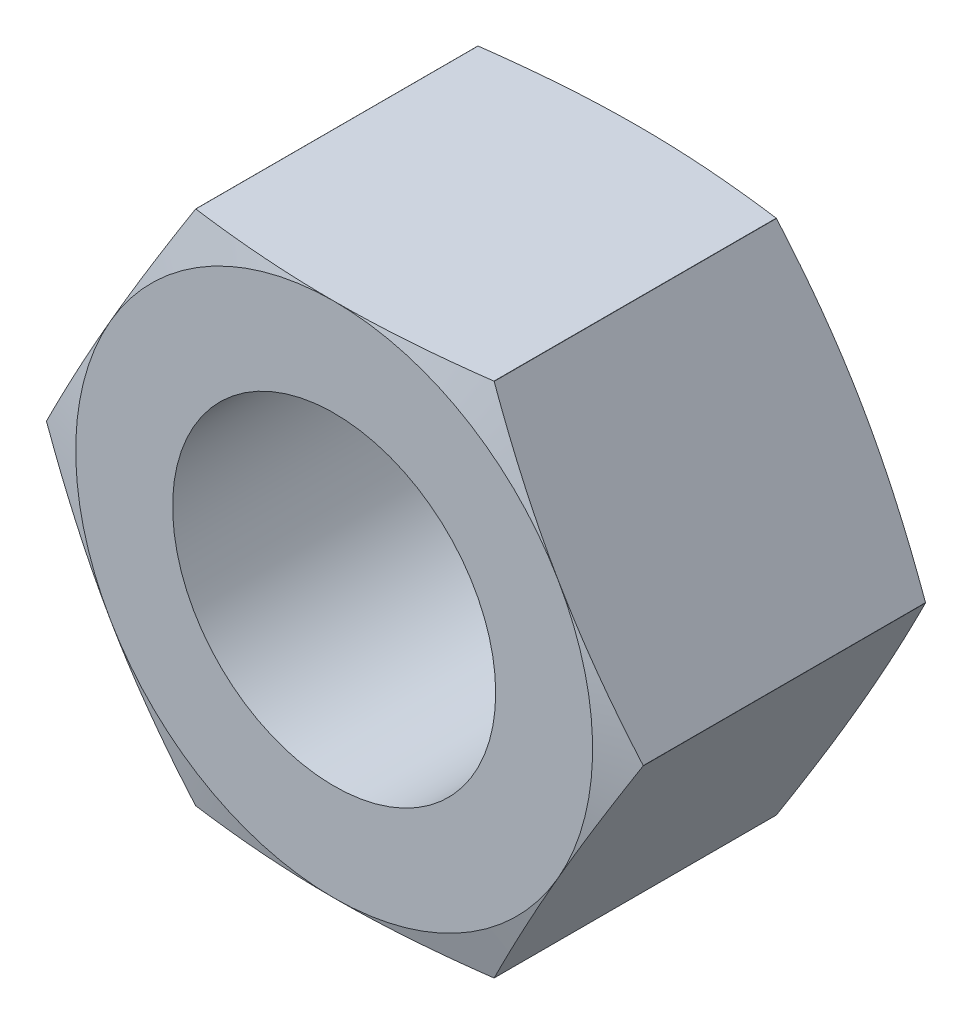
ISO-10303-21;
HEADER;
FILE_DESCRIPTION(('STEP AP214'),'2;1');
FILE_NAME('part.step','',(''),(''),'','','');
FILE_SCHEMA(('AUTOMOTIVE_DESIGN { 1 0 10303 214 1 1 1 1 }'));
ENDSEC;
DATA;
#1=APPLICATION_CONTEXT('core data for automotive mechanical design processes');
#2=APPLICATION_PROTOCOL_DEFINITION('international standard','automotive_design',2000,#1);
#3=PRODUCT_CONTEXT('',#1,'mechanical');
#4=PRODUCT('Part','Part','',(#3));
#5=PRODUCT_RELATED_PRODUCT_CATEGORY('part','',(#4));
#6=PRODUCT_DEFINITION_FORMATION('','',#4);
#7=PRODUCT_DEFINITION_CONTEXT('part definition',#1,'design');
#8=PRODUCT_DEFINITION('design','',#6,#7);
#9=PRODUCT_DEFINITION_SHAPE('','',#8);
#10=(LENGTH_UNIT() NAMED_UNIT(*) SI_UNIT(.MILLI.,.METRE.));
#11=(NAMED_UNIT(*) PLANE_ANGLE_UNIT() SI_UNIT($,.RADIAN.));
#12=(NAMED_UNIT(*) SI_UNIT($,.STERADIAN.) SOLID_ANGLE_UNIT());
#13=UNCERTAINTY_MEASURE_WITH_UNIT(LENGTH_MEASURE(1.E-05),#10,'distance_accuracy_value','');
#14=(GEOMETRIC_REPRESENTATION_CONTEXT(3) GLOBAL_UNCERTAINTY_ASSIGNED_CONTEXT((#13)) GLOBAL_UNIT_ASSIGNED_CONTEXT((#10,
#11,#12)) REPRESENTATION_CONTEXT('',''));
#15=CARTESIAN_POINT('',(0.,0.,0.));
#16=DIRECTION('',(0.,0.,1.));
#17=DIRECTION('',(1.,0.,0.));
#18=AXIS2_PLACEMENT_3D('',#15,#16,#17);
#19=CARTESIAN_POINT('',(0.,0.,0.));
#20=DIRECTION('',(0.,0.,1.));
#21=DIRECTION('',(1.,0.,0.));
#22=AXIS2_PLACEMENT_3D('',#19,#20,#21);
#23=CONICAL_SURFACE('',#22,4.,1.308592322597);
#24=CARTESIAN_POINT('',(0.,0.,0.16580753731));
#25=DIRECTION('',(0.,0.,-1.));
#26=DIRECTION('',(0.999999929611305,0.000375203124259415,0.));
#27=AXIS2_PLACEMENT_3D('',#24,#25,#26);
#28=CIRCLE('',#27,4.617802153517);
#29=CARTESIAN_POINT('',(4.617801828476,0.00173261379521,0.16580753731));
#30=VERTEX_POINT('',#29);
#31=CARTESIAN_POINT('',(4.617801828476,-0.001732613795211,0.16580753731));
#32=VERTEX_POINT('',#31);
#33=EDGE_CURVE('E386',#30,#32,#28,.T.);
#34=ORIENTED_EDGE('',*,*,#33,.T.);
#35=CARTESIAN_POINT('',(3.4641016077439,-2.00000001280694,0.));
#36=CARTESIAN_POINT('',(3.99959787474147,-1.07249327110416,-1.0626646996592E-09));
#37=CARTESIAN_POINT('',(4.617801828477,-0.00173261379480593,0.165807537309771));
#38=(BOUNDED_CURVE() B_SPLINE_CURVE(2,(#35,#36,#37),.UNSPECIFIED.,.F.,
.F.) B_SPLINE_CURVE_WITH_KNOTS((3,3),(0.,1.),
.UNSPECIFIED.) CURVE() GEOMETRIC_REPRESENTATION_ITEM() RATIONAL_B_SPLINE_CURVE((1.,
1.03789463350383,1.)) REPRESENTATION_ITEM(''));
#39=CARTESIAN_POINT('',(3.464101607744,-2.000000012807,0.));
#40=VERTEX_POINT('',#39);
#41=EDGE_CURVE('E231',#40,#32,#38,.T.);
#42=ORIENTED_EDGE('',*,*,#41,.F.);
#43=CARTESIAN_POINT('',(0.,0.,0.));
#44=DIRECTION('',(0.,0.,-1.));
#45=DIRECTION('',(0.866025401935822,0.500000003201897,0.));
#46=AXIS2_PLACEMENT_3D('',#43,#44,#45);
#47=CIRCLE('',#46,4.);
#48=CARTESIAN_POINT('',(3.464101607744,2.000000012807,0.));
#49=VERTEX_POINT('',#48);
#50=EDGE_CURVE('E223',#49,#40,#47,.T.);
#51=ORIENTED_EDGE('',*,*,#50,.F.);
#52=CARTESIAN_POINT('',(4.6178018284753,0.00173261379775691,0.165807537309314));
#53=CARTESIAN_POINT('',(3.99959787474079,1.07249327110535,-1.06266462296389E-09));
#54=CARTESIAN_POINT('',(3.4641016077439,2.00000001280694,0.));
#55=(BOUNDED_CURVE() B_SPLINE_CURVE(2,(#52,#53,#54),.UNSPECIFIED.,.F.,
.F.) B_SPLINE_CURVE_WITH_KNOTS((3,3),(0.,1.),
.UNSPECIFIED.) CURVE() GEOMETRIC_REPRESENTATION_ITEM() RATIONAL_B_SPLINE_CURVE((1.,
1.03789463350372,1.)) REPRESENTATION_ITEM(''));
#56=EDGE_CURVE('E207',#30,#49,#55,.T.);
#57=ORIENTED_EDGE('',*,*,#56,.F.);
#58=EDGE_LOOP('',(#34,#42,#51,#57));
#59=FACE_BOUND('',#58,.T.);
#60=ADVANCED_FACE('F16',(#59),#23,.T.);
#61=CARTESIAN_POINT('',(0.,0.,0.));
#62=DIRECTION('',(0.,0.,1.));
#63=DIRECTION('',(1.,0.,0.));
#64=AXIS2_PLACEMENT_3D('',#61,#62,#63);
#65=CONICAL_SURFACE('',#64,4.,1.308592322597);
#66=CARTESIAN_POINT('',(0.,0.,0.));
#67=DIRECTION('',(0.,0.,1.));
#68=DIRECTION('',(1.,0.,0.));
#69=AXIS2_PLACEMENT_3D('',#66,#67,#68);
#70=CIRCLE('',#69,4.);
#71=CARTESIAN_POINT('',(0.,-4.,0.));
#72=VERTEX_POINT('',#71);
#73=EDGE_CURVE('E234',#72,#40,#70,.T.);
#74=ORIENTED_EDGE('',*,*,#73,.T.);
#75=CARTESIAN_POINT('',(2.31040140180052,-3.99826738620256,0.165807537309363));
#76=CARTESIAN_POINT('',(2.92860534761097,-2.92750674261984,1.06266470623062E-09));
#77=CARTESIAN_POINT('',(3.4641016077439,-2.00000001280694,0.));
#78=(BOUNDED_CURVE() B_SPLINE_CURVE(2,(#75,#76,#77),.UNSPECIFIED.,.F.,
.F.) B_SPLINE_CURVE_WITH_KNOTS((3,3),(0.,1.),
.UNSPECIFIED.) CURVE() GEOMETRIC_REPRESENTATION_ITEM() RATIONAL_B_SPLINE_CURVE((1.,
1.03789463247634,1.)) REPRESENTATION_ITEM(''));
#79=CARTESIAN_POINT('',(2.3104014018,-3.998267386205,0.16580753731));
#80=VERTEX_POINT('',#79);
#81=EDGE_CURVE('E368',#80,#40,#78,.T.);
#82=ORIENTED_EDGE('',*,*,#81,.F.);
#83=CARTESIAN_POINT('',(0.,0.,0.16580753731));
#84=DIRECTION('',(0.,0.,1.));
#85=DIRECTION('',(1.,0.,0.));
#86=AXIS2_PLACEMENT_3D('',#83,#84,#85);
#87=CIRCLE('',#86,4.617802153517);
#88=CARTESIAN_POINT('',(2.307400426676,-4.,0.16580753731));
#89=VERTEX_POINT('',#88);
#90=EDGE_CURVE('E11',#89,#80,#87,.T.);
#91=ORIENTED_EDGE('',*,*,#90,.F.);
#92=CARTESIAN_POINT('',(0.,-4.,0.));
#93=CARTESIAN_POINT('',(1.07099252713086,-4.,0.));
#94=CARTESIAN_POINT('',(2.30740042667724,-4.,0.165807537309668));
#95=(BOUNDED_CURVE() B_SPLINE_CURVE(2,(#92,#93,#94),.UNSPECIFIED.,.F.,
.F.) B_SPLINE_CURVE_WITH_KNOTS((3,3),(0.,1.),
.UNSPECIFIED.) CURVE() GEOMETRIC_REPRESENTATION_ITEM() RATIONAL_B_SPLINE_CURVE((1.,
1.0378946329901,1.)) REPRESENTATION_ITEM(''));
#96=EDGE_CURVE('E28',#72,#89,#95,.T.);
#97=ORIENTED_EDGE('',*,*,#96,.F.);
#98=EDGE_LOOP('',(#74,#82,#91,#97));
#99=FACE_BOUND('',#98,.T.);
#100=ADVANCED_FACE('F558',(#99),#65,.T.);
#101=CARTESIAN_POINT('',(0.,0.,0.));
#102=DIRECTION('',(0.,0.,1.));
#103=DIRECTION('',(1.,0.,0.));
#104=AXIS2_PLACEMENT_3D('',#101,#102,#103);
#105=CONICAL_SURFACE('',#104,4.,1.308592322597);
#106=CARTESIAN_POINT('',(0.,0.,0.));
#107=DIRECTION('',(0.,0.,1.));
#108=DIRECTION('',(1.,0.,0.));
#109=AXIS2_PLACEMENT_3D('',#106,#107,#108);
#110=CIRCLE('',#109,4.);
#111=CARTESIAN_POINT('',(-3.464101607744,-2.000000012807,0.));
#112=VERTEX_POINT('',#111);
#113=EDGE_CURVE('E241',#112,#72,#110,.T.);
#114=ORIENTED_EDGE('',*,*,#113,.T.);
#115=CARTESIAN_POINT('',(-2.30740042667229,-4.,0.165807537309004));
#116=CARTESIAN_POINT('',(-1.07099252712877,-4.,0.));
#117=CARTESIAN_POINT('',(0.,-4.,0.));
#118=(BOUNDED_CURVE() B_SPLINE_CURVE(2,(#115,#116,#117),.UNSPECIFIED.,.F.,
.F.) B_SPLINE_CURVE_WITH_KNOTS((3,3),(0.,1.),
.UNSPECIFIED.) CURVE() GEOMETRIC_REPRESENTATION_ITEM() RATIONAL_B_SPLINE_CURVE((1.,
1.03789463298995,1.)) REPRESENTATION_ITEM(''));
#119=CARTESIAN_POINT('',(-2.307400426676,-4.,0.16580753731));
#120=VERTEX_POINT('',#119);
#121=EDGE_CURVE('E20',#120,#72,#118,.T.);
#122=ORIENTED_EDGE('',*,*,#121,.F.);
#123=CARTESIAN_POINT('',(0.,0.,0.16580753731));
#124=DIRECTION('',(0.,0.,1.));
#125=DIRECTION('',(1.,0.,0.));
#126=AXIS2_PLACEMENT_3D('',#123,#124,#125);
#127=CIRCLE('',#126,4.617802153517);
#128=CARTESIAN_POINT('',(-2.3104014018,-3.998267386205,0.16580753731));
#129=VERTEX_POINT('',#128);
#130=EDGE_CURVE('E498',#129,#120,#127,.T.);
#131=ORIENTED_EDGE('',*,*,#130,.F.);
#132=CARTESIAN_POINT('',(-3.4641016077439,-2.00000001280694,0.));
#133=CARTESIAN_POINT('',(-2.92860534761033,-2.92750674262094,1.06266461828561E-09));
#134=CARTESIAN_POINT('',(-2.31040140179894,-3.9982673862053,0.165807537309788));
#135=(BOUNDED_CURVE() B_SPLINE_CURVE(2,(#132,#133,#134),.UNSPECIFIED.,.F.,
.F.) B_SPLINE_CURVE_WITH_KNOTS((3,3),(0.,1.),
.UNSPECIFIED.) CURVE() GEOMETRIC_REPRESENTATION_ITEM() RATIONAL_B_SPLINE_CURVE((1.,
1.03789463247645,1.)) REPRESENTATION_ITEM(''));
#136=EDGE_CURVE('E527',#112,#129,#135,.T.);
#137=ORIENTED_EDGE('',*,*,#136,.F.);
#138=EDGE_LOOP('',(#114,#122,#131,#137));
#139=FACE_BOUND('',#138,.T.);
#140=ADVANCED_FACE('F18',(#139),#105,.T.);
#141=CARTESIAN_POINT('',(0.,0.,0.));
#142=DIRECTION('',(0.,0.,1.));
#143=DIRECTION('',(1.,0.,0.));
#144=AXIS2_PLACEMENT_3D('',#141,#142,#143);
#145=CONICAL_SURFACE('',#144,4.,1.308592322597);
#146=CARTESIAN_POINT('',(-3.46410161603001,1.999999998455,0.));
#147=CARTESIAN_POINT('',(-3.99959787918154,1.07249326341375,1.28197105117661E-10));
#148=CARTESIAN_POINT('',(-4.617801828477,0.00173261379480638,0.165807537309771));
#149=(BOUNDED_CURVE() B_SPLINE_CURVE(2,(#146,#147,#148),.UNSPECIFIED.,.F.,
.F.) B_SPLINE_CURVE_WITH_KNOTS((3,3),(0.,1.),
.UNSPECIFIED.) CURVE() GEOMETRIC_REPRESENTATION_ITEM() RATIONAL_B_SPLINE_CURVE((1.,
1.03789463292816,1.)) REPRESENTATION_ITEM(''));
#150=CARTESIAN_POINT('',(-3.46410161603,1.999999998455,0.));
#151=VERTEX_POINT('',#150);
#152=CARTESIAN_POINT('',(-4.617801828476,0.001732613795212,0.16580753731));
#153=VERTEX_POINT('',#152);
#154=EDGE_CURVE('E491',#151,#153,#149,.T.);
#155=ORIENTED_EDGE('',*,*,#154,.F.);
#156=CARTESIAN_POINT('',(0.,0.,0.));
#157=DIRECTION('',(0.,0.,1.));
#158=DIRECTION('',(1.,0.,0.));
#159=AXIS2_PLACEMENT_3D('',#156,#157,#158);
#160=CIRCLE('',#159,4.);
#161=EDGE_CURVE('E258',#151,#112,#160,.T.);
#162=ORIENTED_EDGE('',*,*,#161,.T.);
#163=CARTESIAN_POINT('',(-4.6178018284753,-0.00173261379775847,0.165807537309314));
#164=CARTESIAN_POINT('',(-3.99959787474079,-1.07249327110535,-1.06266462296389E-09));
#165=CARTESIAN_POINT('',(-3.4641016077439,-2.00000001280694,0.));
#166=(BOUNDED_CURVE() B_SPLINE_CURVE(2,(#163,#164,#165),.UNSPECIFIED.,.F.,
.F.) B_SPLINE_CURVE_WITH_KNOTS((3,3),(0.,1.),
.UNSPECIFIED.) CURVE() GEOMETRIC_REPRESENTATION_ITEM() RATIONAL_B_SPLINE_CURVE((1.,
1.03789463350372,1.)) REPRESENTATION_ITEM(''));
#167=CARTESIAN_POINT('',(-4.617801828476,-0.001732613795211,0.16580753731));
#168=VERTEX_POINT('',#167);
#169=EDGE_CURVE('E276',#168,#112,#166,.T.);
#170=ORIENTED_EDGE('',*,*,#169,.F.);
#171=CARTESIAN_POINT('',(0.,0.,0.16580753731));
#172=DIRECTION('',(0.,0.,1.));
#173=DIRECTION('',(1.,0.,0.));
#174=AXIS2_PLACEMENT_3D('',#171,#172,#173);
#175=CIRCLE('',#174,4.617802153517);
#176=EDGE_CURVE('E504',#153,#168,#175,.T.);
#177=ORIENTED_EDGE('',*,*,#176,.F.);
#178=EDGE_LOOP('',(#155,#162,#170,#177));
#179=FACE_BOUND('',#178,.T.);
#180=ADVANCED_FACE('F586',(#179),#145,.T.);
#181=CARTESIAN_POINT('',(0.,0.,0.));
#182=DIRECTION('',(0.,0.,1.));
#183=DIRECTION('',(1.,0.,0.));
#184=AXIS2_PLACEMENT_3D('',#181,#182,#183);
#185=CONICAL_SURFACE('',#184,4.,1.308592322597);
#186=CARTESIAN_POINT('',(2.69946742916274E-13,4.,0.));
#187=CARTESIAN_POINT('',(-1.07099252713066,4.,0.));
#188=CARTESIAN_POINT('',(-2.30740042667724,4.,0.165807537309668));
#189=(BOUNDED_CURVE() B_SPLINE_CURVE(2,(#186,#187,#188),.UNSPECIFIED.,.F.,
.F.) B_SPLINE_CURVE_WITH_KNOTS((3,3),(0.,1.),
.UNSPECIFIED.) CURVE() GEOMETRIC_REPRESENTATION_ITEM() RATIONAL_B_SPLINE_CURVE((1.,
1.03789463299012,1.)) REPRESENTATION_ITEM(''));
#190=CARTESIAN_POINT('',(2.69462570454E-13,4.,0.));
#191=VERTEX_POINT('',#190);
#192=CARTESIAN_POINT('',(-2.307400426676,4.,0.16580753731));
#193=VERTEX_POINT('',#192);
#194=EDGE_CURVE('E425',#191,#193,#189,.T.);
#195=ORIENTED_EDGE('',*,*,#194,.F.);
#196=CARTESIAN_POINT('',(0.,0.,0.));
#197=DIRECTION('',(0.,0.,1.));
#198=DIRECTION('',(1.,0.,0.));
#199=AXIS2_PLACEMENT_3D('',#196,#197,#198);
#200=CIRCLE('',#199,4.);
#201=EDGE_CURVE('E226',#191,#151,#200,.T.);
#202=ORIENTED_EDGE('',*,*,#201,.T.);
#203=CARTESIAN_POINT('',(-2.31040140180052,3.99826738620256,0.165807537309363));
#204=CARTESIAN_POINT('',(-2.92860535205103,2.92750673492943,-1.28197091830984E-10));
#205=CARTESIAN_POINT('',(-3.46410161603001,1.999999998455,0.));
#206=(BOUNDED_CURVE() B_SPLINE_CURVE(2,(#203,#204,#205),.UNSPECIFIED.,.F.,
.F.) B_SPLINE_CURVE_WITH_KNOTS((3,3),(0.,1.),
.UNSPECIFIED.) CURVE() GEOMETRIC_REPRESENTATION_ITEM() RATIONAL_B_SPLINE_CURVE((1.,
1.03789463305202,1.)) REPRESENTATION_ITEM(''));
#207=CARTESIAN_POINT('',(-2.3104014018,3.998267386205,0.16580753731));
#208=VERTEX_POINT('',#207);
#209=EDGE_CURVE('E482',#208,#151,#206,.T.);
#210=ORIENTED_EDGE('',*,*,#209,.F.);
#211=CARTESIAN_POINT('',(0.,0.,0.16580753731));
#212=DIRECTION('',(0.,0.,1.));
#213=DIRECTION('',(1.,0.,0.));
#214=AXIS2_PLACEMENT_3D('',#211,#212,#213);
#215=CIRCLE('',#214,4.617802153517);
#216=EDGE_CURVE('E417',#193,#208,#215,.T.);
#217=ORIENTED_EDGE('',*,*,#216,.F.);
#218=EDGE_LOOP('',(#195,#202,#210,#217));
#219=FACE_BOUND('',#218,.T.);
#220=ADVANCED_FACE('F592',(#219),#185,.T.);
#221=CARTESIAN_POINT('',(0.,0.,0.));
#222=DIRECTION('',(0.,0.,1.));
#223=DIRECTION('',(1.,0.,0.));
#224=AXIS2_PLACEMENT_3D('',#221,#222,#223);
#225=CONICAL_SURFACE('',#224,4.,1.308592322597);
#226=CARTESIAN_POINT('',(3.4641016077439,2.00000001280694,0.));
#227=CARTESIAN_POINT('',(2.92860534761033,2.92750674262094,1.06266461828561E-09));
#228=CARTESIAN_POINT('',(2.31040140179894,3.9982673862053,0.165807537309788));
#229=(BOUNDED_CURVE() B_SPLINE_CURVE(2,(#226,#227,#228),.UNSPECIFIED.,.F.,
.F.) B_SPLINE_CURVE_WITH_KNOTS((3,3),(0.,1.),
.UNSPECIFIED.) CURVE() GEOMETRIC_REPRESENTATION_ITEM() RATIONAL_B_SPLINE_CURVE((1.,
1.03789463247645,1.)) REPRESENTATION_ITEM(''));
#230=CARTESIAN_POINT('',(2.3104014018,3.998267386205,0.16580753731));
#231=VERTEX_POINT('',#230);
#232=EDGE_CURVE('E195',#49,#231,#229,.T.);
#233=ORIENTED_EDGE('',*,*,#232,.F.);
#234=CARTESIAN_POINT('',(0.,0.,0.));
#235=DIRECTION('',(0.,0.,1.));
#236=DIRECTION('',(1.,0.,0.));
#237=AXIS2_PLACEMENT_3D('',#234,#235,#236);
#238=CIRCLE('',#237,4.);
#239=EDGE_CURVE('E199',#49,#191,#238,.T.);
#240=ORIENTED_EDGE('',*,*,#239,.T.);
#241=CARTESIAN_POINT('',(2.30740042667229,4.,0.165807537309004));
#242=CARTESIAN_POINT('',(1.07099252712896,4.00000000000001,0.));
#243=CARTESIAN_POINT('',(2.69946742916274E-13,4.,0.));
#244=(BOUNDED_CURVE() B_SPLINE_CURVE(2,(#241,#242,#243),.UNSPECIFIED.,.F.,
.F.) B_SPLINE_CURVE_WITH_KNOTS((3,3),(0.,1.),
.UNSPECIFIED.) CURVE() GEOMETRIC_REPRESENTATION_ITEM() RATIONAL_B_SPLINE_CURVE((1.,
1.03789463298995,1.)) REPRESENTATION_ITEM(''));
#245=CARTESIAN_POINT('',(2.307400426676,4.,0.16580753731));
#246=VERTEX_POINT('',#245);
#247=EDGE_CURVE('E339',#246,#191,#244,.T.);
#248=ORIENTED_EDGE('',*,*,#247,.F.);
#249=CARTESIAN_POINT('',(0.,0.,0.16580753731));
#250=DIRECTION('',(0.,0.,1.));
#251=DIRECTION('',(1.,0.,0.));
#252=AXIS2_PLACEMENT_3D('',#249,#250,#251);
#253=CIRCLE('',#252,4.617802153517);
#254=EDGE_CURVE('E202',#231,#246,#253,.T.);
#255=ORIENTED_EDGE('',*,*,#254,.F.);
#256=EDGE_LOOP('',(#233,#240,#248,#255));
#257=FACE_BOUND('',#256,.T.);
#258=ADVANCED_FACE('F197',(#257),#225,.T.);
#259=CARTESIAN_POINT('',(0.,0.,4.53419246269));
#260=DIRECTION('',(0.,0.,-1.));
#261=DIRECTION('',(1.,0.,0.));
#262=AXIS2_PLACEMENT_3D('',#259,#260,#261);
#263=CONICAL_SURFACE('',#262,4.617802153517,1.308592322597);
#264=CARTESIAN_POINT('',(0.,0.,4.7));
#265=DIRECTION('',(0.,0.,1.));
#266=DIRECTION('',(0.866025401935822,-0.500000003201897,0.));
#267=AXIS2_PLACEMENT_3D('',#264,#265,#266);
#268=CIRCLE('',#267,4.);
#269=CARTESIAN_POINT('',(3.464101607744,-2.000000012807,4.7));
#270=VERTEX_POINT('',#269);
#271=CARTESIAN_POINT('',(3.464101607744,2.000000012807,4.7));
#272=VERTEX_POINT('',#271);
#273=EDGE_CURVE('E247',#270,#272,#268,.T.);
#274=ORIENTED_EDGE('',*,*,#273,.F.);
#275=CARTESIAN_POINT('',(4.6178018284753,-0.00173261379776002,4.53419246269069));
#276=CARTESIAN_POINT('',(3.99959787474079,-1.07249327110535,4.70000000106267));
#277=CARTESIAN_POINT('',(3.4641016077439,-2.00000001280694,4.7));
#278=(BOUNDED_CURVE() B_SPLINE_CURVE(2,(#275,#276,#277),.UNSPECIFIED.,.F.,
.F.) B_SPLINE_CURVE_WITH_KNOTS((3,3),(0.,1.),
.UNSPECIFIED.) CURVE() GEOMETRIC_REPRESENTATION_ITEM() RATIONAL_B_SPLINE_CURVE((1.,
1.03789463350375,1.)) REPRESENTATION_ITEM(''));
#279=CARTESIAN_POINT('',(4.617801828476,-0.001732613795211,4.53419246269));
#280=VERTEX_POINT('',#279);
#281=EDGE_CURVE('E288',#280,#270,#278,.T.);
#282=ORIENTED_EDGE('',*,*,#281,.F.);
#283=CARTESIAN_POINT('',(0.,0.,4.53419246269));
#284=DIRECTION('',(0.,0.,-1.));
#285=DIRECTION('',(0.999999929611305,0.000375203124259415,0.));
#286=AXIS2_PLACEMENT_3D('',#283,#284,#285);
#287=CIRCLE('',#286,4.617802153517);
#288=CARTESIAN_POINT('',(4.617801828476,0.00173261379521,4.53419246269));
#289=VERTEX_POINT('',#288);
#290=EDGE_CURVE('E380',#289,#280,#287,.T.);
#291=ORIENTED_EDGE('',*,*,#290,.F.);
#292=CARTESIAN_POINT('',(3.4641016077439,2.00000001280694,4.7));
#293=CARTESIAN_POINT('',(3.99959787474147,1.07249327110416,4.70000000106266));
#294=CARTESIAN_POINT('',(4.617801828477,0.00173261379480483,4.53419246269023));
#295=(BOUNDED_CURVE() B_SPLINE_CURVE(2,(#292,#293,#294),.UNSPECIFIED.,.F.,
.F.) B_SPLINE_CURVE_WITH_KNOTS((3,3),(0.,1.),
.UNSPECIFIED.) CURVE() GEOMETRIC_REPRESENTATION_ITEM() RATIONAL_B_SPLINE_CURVE((1.,
1.03789463350381,1.)) REPRESENTATION_ITEM(''));
#296=EDGE_CURVE('E217',#272,#289,#295,.T.);
#297=ORIENTED_EDGE('',*,*,#296,.F.);
#298=EDGE_LOOP('',(#274,#282,#291,#297));
#299=FACE_BOUND('',#298,.T.);
#300=ADVANCED_FACE('F605',(#299),#263,.T.);
#301=CARTESIAN_POINT('',(0.,0.,4.53419246269));
#302=DIRECTION('',(0.,0.,-1.));
#303=DIRECTION('',(1.,0.,0.));
#304=AXIS2_PLACEMENT_3D('',#301,#302,#303);
#305=CONICAL_SURFACE('',#304,4.617802153517,1.308592322597);
#306=CARTESIAN_POINT('',(2.31040140180052,3.99826738620256,4.53419246269064));
#307=CARTESIAN_POINT('',(2.92860534761097,2.92750674261984,4.69999999893734));
#308=CARTESIAN_POINT('',(3.4641016077439,2.00000001280694,4.7));
#309=(BOUNDED_CURVE() B_SPLINE_CURVE(2,(#306,#307,#308),.UNSPECIFIED.,.F.,
.F.) B_SPLINE_CURVE_WITH_KNOTS((3,3),(0.,1.),
.UNSPECIFIED.) CURVE() GEOMETRIC_REPRESENTATION_ITEM() RATIONAL_B_SPLINE_CURVE((1.,
1.03789463247635,1.)) REPRESENTATION_ITEM(''));
#310=CARTESIAN_POINT('',(2.3104014018,3.998267386205,4.53419246269));
#311=VERTEX_POINT('',#310);
#312=EDGE_CURVE('E394',#311,#272,#309,.T.);
#313=ORIENTED_EDGE('',*,*,#312,.F.);
#314=CARTESIAN_POINT('',(0.,0.,4.53419246269));
#315=DIRECTION('',(0.,0.,1.));
#316=DIRECTION('',(1.,0.,0.));
#317=AXIS2_PLACEMENT_3D('',#314,#315,#316);
#318=CIRCLE('',#317,4.617802153517);
#319=CARTESIAN_POINT('',(2.307400426676,4.,4.53419246269));
#320=VERTEX_POINT('',#319);
#321=EDGE_CURVE('E296',#311,#320,#318,.T.);
#322=ORIENTED_EDGE('',*,*,#321,.T.);
#323=CARTESIAN_POINT('',(2.70390832126105E-13,4.,4.7));
#324=CARTESIAN_POINT('',(1.07099252713095,4.,4.69999999999998));
#325=CARTESIAN_POINT('',(2.30740042667724,4.,4.53419246269033));
#326=(BOUNDED_CURVE() B_SPLINE_CURVE(2,(#323,#324,#325),.UNSPECIFIED.,.F.,
.F.) B_SPLINE_CURVE_WITH_KNOTS((3,3),(0.,1.),
.UNSPECIFIED.) CURVE() GEOMETRIC_REPRESENTATION_ITEM() RATIONAL_B_SPLINE_CURVE((1.,
1.03789463299009,1.)) REPRESENTATION_ITEM(''));
#327=CARTESIAN_POINT('',(2.69462570454E-13,4.,4.7));
#328=VERTEX_POINT('',#327);
#329=EDGE_CURVE('E331',#328,#320,#326,.T.);
#330=ORIENTED_EDGE('',*,*,#329,.F.);
#331=CARTESIAN_POINT('',(0.,0.,4.7));
#332=DIRECTION('',(0.,0.,1.));
#333=DIRECTION('',(1.,0.,0.));
#334=AXIS2_PLACEMENT_3D('',#331,#332,#333);
#335=CIRCLE('',#334,4.);
#336=EDGE_CURVE('E250',#272,#328,#335,.T.);
#337=ORIENTED_EDGE('',*,*,#336,.F.);
#338=EDGE_LOOP('',(#313,#322,#330,#337));
#339=FACE_BOUND('',#338,.T.);
#340=ADVANCED_FACE('F602',(#339),#305,.T.);
#341=CARTESIAN_POINT('',(0.,0.,4.53419246269));
#342=DIRECTION('',(0.,0.,-1.));
#343=DIRECTION('',(1.,0.,0.));
#344=AXIS2_PLACEMENT_3D('',#341,#342,#343);
#345=CONICAL_SURFACE('',#344,4.617802153517,1.308592322597);
#346=CARTESIAN_POINT('',(0.,0.,4.7));
#347=DIRECTION('',(0.,0.,1.));
#348=DIRECTION('',(1.,0.,0.));
#349=AXIS2_PLACEMENT_3D('',#346,#347,#348);
#350=CIRCLE('',#349,4.);
#351=CARTESIAN_POINT('',(-3.46410161603,1.999999998455,4.7));
#352=VERTEX_POINT('',#351);
#353=EDGE_CURVE('E253',#328,#352,#350,.T.);
#354=ORIENTED_EDGE('',*,*,#353,.F.);
#355=CARTESIAN_POINT('',(-2.30740042667229,4.,4.534192462691));
#356=CARTESIAN_POINT('',(-1.07099252712867,4.,4.70000000000002));
#357=CARTESIAN_POINT('',(2.70390832126105E-13,4.,4.7));
#358=(BOUNDED_CURVE() B_SPLINE_CURVE(2,(#355,#356,#357),.UNSPECIFIED.,.F.,
.F.) B_SPLINE_CURVE_WITH_KNOTS((3,3),(0.,1.),
.UNSPECIFIED.) CURVE() GEOMETRIC_REPRESENTATION_ITEM() RATIONAL_B_SPLINE_CURVE((1.,
1.03789463298997,1.)) REPRESENTATION_ITEM(''));
#359=CARTESIAN_POINT('',(-2.307400426676,4.,4.53419246269));
#360=VERTEX_POINT('',#359);
#361=EDGE_CURVE('E340',#360,#328,#358,.T.);
#362=ORIENTED_EDGE('',*,*,#361,.F.);
#363=CARTESIAN_POINT('',(0.,0.,4.53419246269));
#364=DIRECTION('',(0.,0.,1.));
#365=DIRECTION('',(1.,0.,0.));
#366=AXIS2_PLACEMENT_3D('',#363,#364,#365);
#367=CIRCLE('',#366,4.617802153517);
#368=CARTESIAN_POINT('',(-2.3104014018,3.998267386205,4.53419246269));
#369=VERTEX_POINT('',#368);
#370=EDGE_CURVE('E471',#360,#369,#367,.T.);
#371=ORIENTED_EDGE('',*,*,#370,.T.);
#372=CARTESIAN_POINT('',(-3.46410161603001,1.999999998455,4.7));
#373=CARTESIAN_POINT('',(-2.92860535205039,2.92750673493053,4.70000000012819));
#374=CARTESIAN_POINT('',(-2.31040140179894,3.9982673862053,4.53419246269021));
#375=(BOUNDED_CURVE() B_SPLINE_CURVE(2,(#372,#373,#374),.UNSPECIFIED.,.F.,
.F.) B_SPLINE_CURVE_WITH_KNOTS((3,3),(0.,1.),
.UNSPECIFIED.) CURVE() GEOMETRIC_REPRESENTATION_ITEM() RATIONAL_B_SPLINE_CURVE((1.,
1.03789463305214,1.)) REPRESENTATION_ITEM(''));
#376=EDGE_CURVE('E309',#352,#369,#375,.T.);
#377=ORIENTED_EDGE('',*,*,#376,.F.);
#378=EDGE_LOOP('',(#354,#362,#371,#377));
#379=FACE_BOUND('',#378,.T.);
#380=ADVANCED_FACE('F662',(#379),#345,.T.);
#381=CARTESIAN_POINT('',(0.,0.,4.53419246269));
#382=DIRECTION('',(0.,0.,-1.));
#383=DIRECTION('',(1.,0.,0.));
#384=AXIS2_PLACEMENT_3D('',#381,#382,#383);
#385=CONICAL_SURFACE('',#384,4.617802153517,1.308592322597);
#386=CARTESIAN_POINT('',(0.,0.,4.7));
#387=DIRECTION('',(0.,0.,1.));
#388=DIRECTION('',(1.,0.,0.));
#389=AXIS2_PLACEMENT_3D('',#386,#387,#388);
#390=CIRCLE('',#389,4.);
#391=CARTESIAN_POINT('',(-3.464101607744,-2.000000012807,4.7));
#392=VERTEX_POINT('',#391);
#393=EDGE_CURVE('E262',#352,#392,#390,.T.);
#394=ORIENTED_EDGE('',*,*,#393,.F.);
#395=CARTESIAN_POINT('',(-4.6178018284753,0.00173261379776157,4.53419246269069));
#396=CARTESIAN_POINT('',(-3.99959787918085,1.07249326341494,4.6999999998718));
#397=CARTESIAN_POINT('',(-3.46410161603001,1.999999998455,4.7));
#398=(BOUNDED_CURVE() B_SPLINE_CURVE(2,(#395,#396,#397),.UNSPECIFIED.,.F.,
.F.) B_SPLINE_CURVE_WITH_KNOTS((3,3),(0.,1.),
.UNSPECIFIED.) CURVE() GEOMETRIC_REPRESENTATION_ITEM() RATIONAL_B_SPLINE_CURVE((1.,
1.03789463292808,1.)) REPRESENTATION_ITEM(''));
#399=CARTESIAN_POINT('',(-4.617801828476,0.001732613795212,4.53419246269));
#400=VERTEX_POINT('',#399);
#401=EDGE_CURVE('E303',#400,#352,#398,.T.);
#402=ORIENTED_EDGE('',*,*,#401,.F.);
#403=CARTESIAN_POINT('',(0.,0.,4.53419246269));
#404=DIRECTION('',(0.,0.,1.));
#405=DIRECTION('',(1.,0.,0.));
#406=AXIS2_PLACEMENT_3D('',#403,#404,#405);
#407=CIRCLE('',#406,4.617802153517);
#408=CARTESIAN_POINT('',(-4.617801828476,-0.001732613795211,4.53419246269));
#409=VERTEX_POINT('',#408);
#410=EDGE_CURVE('E515',#400,#409,#407,.T.);
#411=ORIENTED_EDGE('',*,*,#410,.T.);
#412=CARTESIAN_POINT('',(-3.4641016077439,-2.00000001280694,4.7));
#413=CARTESIAN_POINT('',(-3.99959787474148,-1.07249327110416,4.70000000106267));
#414=CARTESIAN_POINT('',(-4.617801828477,-0.00173261379480527,4.53419246269023));
#415=(BOUNDED_CURVE() B_SPLINE_CURVE(2,(#412,#413,#414),.UNSPECIFIED.,.F.,
.F.) B_SPLINE_CURVE_WITH_KNOTS((3,3),(0.,1.),
.UNSPECIFIED.) CURVE() GEOMETRIC_REPRESENTATION_ITEM() RATIONAL_B_SPLINE_CURVE((1.,
1.0378946335038,1.)) REPRESENTATION_ITEM(''));
#416=EDGE_CURVE('E271',#392,#409,#415,.T.);
#417=ORIENTED_EDGE('',*,*,#416,.F.);
#418=EDGE_LOOP('',(#394,#402,#411,#417));
#419=FACE_BOUND('',#418,.T.);
#420=ADVANCED_FACE('F659',(#419),#385,.T.);
#421=CARTESIAN_POINT('',(0.,0.,4.53419246269));
#422=DIRECTION('',(0.,0.,-1.));
#423=DIRECTION('',(1.,0.,0.));
#424=AXIS2_PLACEMENT_3D('',#421,#422,#423);
#425=CONICAL_SURFACE('',#424,4.617802153517,1.308592322597);
#426=CARTESIAN_POINT('',(0.,-4.,4.7));
#427=CARTESIAN_POINT('',(-1.07099252713076,-4.00000000000001,4.70000000000001));
#428=CARTESIAN_POINT('',(-2.30740042667724,-4.,4.53419246269033));
#429=(BOUNDED_CURVE() B_SPLINE_CURVE(2,(#426,#427,#428),.UNSPECIFIED.,.F.,
.F.) B_SPLINE_CURVE_WITH_KNOTS((3,3),(0.,1.),
.UNSPECIFIED.) CURVE() GEOMETRIC_REPRESENTATION_ITEM() RATIONAL_B_SPLINE_CURVE((1.,
1.03789463299015,1.)) REPRESENTATION_ITEM(''));
#430=CARTESIAN_POINT('',(0.,-4.,4.7));
#431=VERTEX_POINT('',#430);
#432=CARTESIAN_POINT('',(-2.307400426676,-4.,4.53419246269));
#433=VERTEX_POINT('',#432);
#434=EDGE_CURVE('E49',#431,#433,#429,.T.);
#435=ORIENTED_EDGE('',*,*,#434,.F.);
#436=CARTESIAN_POINT('',(0.,0.,4.7));
#437=DIRECTION('',(0.,0.,1.));
#438=DIRECTION('',(1.,0.,0.));
#439=AXIS2_PLACEMENT_3D('',#436,#437,#438);
#440=CIRCLE('',#439,4.);
#441=EDGE_CURVE('E317',#392,#431,#440,.T.);
#442=ORIENTED_EDGE('',*,*,#441,.F.);
#443=CARTESIAN_POINT('',(-2.31040140180052,-3.99826738620256,4.53419246269064));
#444=CARTESIAN_POINT('',(-2.92860534761097,-2.92750674261984,4.69999999893734));
#445=CARTESIAN_POINT('',(-3.4641016077439,-2.00000001280694,4.7));
#446=(BOUNDED_CURVE() B_SPLINE_CURVE(2,(#443,#444,#445),.UNSPECIFIED.,.F.,
.F.) B_SPLINE_CURVE_WITH_KNOTS((3,3),(0.,1.),
.UNSPECIFIED.) CURVE() GEOMETRIC_REPRESENTATION_ITEM() RATIONAL_B_SPLINE_CURVE((1.,
1.03789463247635,1.)) REPRESENTATION_ITEM(''));
#447=CARTESIAN_POINT('',(-2.3104014018,-3.998267386205,4.53419246269));
#448=VERTEX_POINT('',#447);
#449=EDGE_CURVE('E277',#448,#392,#446,.T.);
#450=ORIENTED_EDGE('',*,*,#449,.F.);
#451=CARTESIAN_POINT('',(0.,0.,4.53419246269));
#452=DIRECTION('',(0.,0.,1.));
#453=DIRECTION('',(1.,0.,0.));
#454=AXIS2_PLACEMENT_3D('',#451,#452,#453);
#455=CIRCLE('',#454,4.617802153517);
#456=EDGE_CURVE('E263',#448,#433,#455,.T.);
#457=ORIENTED_EDGE('',*,*,#456,.T.);
#458=EDGE_LOOP('',(#435,#442,#450,#457));
#459=FACE_BOUND('',#458,.T.);
#460=ADVANCED_FACE('F578',(#459),#425,.T.);
#461=CARTESIAN_POINT('',(0.,0.,0.16580753731));
#462=DIRECTION('',(0.,0.,1.));
#463=DIRECTION('',(1.,0.,0.));
#464=AXIS2_PLACEMENT_3D('',#461,#462,#463);
#465=CYLINDRICAL_SURFACE('',#464,4.617802153517);
#466=ORIENTED_EDGE('',*,*,#90,.T.);
#467=DIRECTION('',(0.,0.,1.));
#468=VECTOR('',#467,1.);
#469=CARTESIAN_POINT('',(2.3104014018,-3.998267386205,0.16580753731));
#470=LINE('',#469,#468);
#471=CARTESIAN_POINT('',(2.3104014018,-3.998267386205,4.53419246269));
#472=VERTEX_POINT('',#471);
#473=EDGE_CURVE('E362',#80,#472,#470,.T.);
#474=ORIENTED_EDGE('',*,*,#473,.T.);
#475=CARTESIAN_POINT('',(0.,0.,4.53419246269));
#476=DIRECTION('',(0.,0.,1.));
#477=DIRECTION('',(1.,0.,0.));
#478=AXIS2_PLACEMENT_3D('',#475,#476,#477);
#479=CIRCLE('',#478,4.617802153517);
#480=CARTESIAN_POINT('',(2.307400426676,-4.,4.53419246269));
#481=VERTEX_POINT('',#480);
#482=EDGE_CURVE('E321',#481,#472,#479,.T.);
#483=ORIENTED_EDGE('',*,*,#482,.F.);
#484=DIRECTION('',(0.,0.,1.));
#485=VECTOR('',#484,1.);
#486=CARTESIAN_POINT('',(2.307400426676,-4.,0.16580753731));
#487=LINE('',#486,#485);
#488=EDGE_CURVE('E266',#89,#481,#487,.T.);
#489=ORIENTED_EDGE('',*,*,#488,.F.);
#490=EDGE_LOOP('',(#466,#474,#483,#489));
#491=FACE_BOUND('',#490,.T.);
#492=ADVANCED_FACE('F565',(#491),#465,.T.);
#493=CARTESIAN_POINT('',(-2.309401076759,-4.,0.));
#494=DIRECTION('',(0.,1.,0.));
#495=DIRECTION('',(1.,0.,0.));
#496=AXIS2_PLACEMENT_3D('',#493,#494,#495);
#497=PLANE('',#496);
#498=ORIENTED_EDGE('',*,*,#488,.T.);
#499=CARTESIAN_POINT('',(2.30740042667229,-4.,4.534192462691));
#500=CARTESIAN_POINT('',(1.07099252712887,-4.,4.7));
#501=CARTESIAN_POINT('',(0.,-4.,4.7));
#502=(BOUNDED_CURVE() B_SPLINE_CURVE(2,(#499,#500,#501),.UNSPECIFIED.,.F.,
.F.) B_SPLINE_CURVE_WITH_KNOTS((3,3),(0.,1.),
.UNSPECIFIED.) CURVE() GEOMETRIC_REPRESENTATION_ITEM() RATIONAL_B_SPLINE_CURVE((1.,
1.03789463298996,1.)) REPRESENTATION_ITEM(''));
#503=EDGE_CURVE('E289',#481,#431,#502,.T.);
#504=ORIENTED_EDGE('',*,*,#503,.T.);
#505=ORIENTED_EDGE('',*,*,#434,.T.);
#506=DIRECTION('',(0.,0.,1.));
#507=VECTOR('',#506,1.);
#508=CARTESIAN_POINT('',(-2.307400426676,-4.,0.16580753731));
#509=LINE('',#508,#507);
#510=EDGE_CURVE('E267',#120,#433,#509,.T.);
#511=ORIENTED_EDGE('',*,*,#510,.F.);
#512=ORIENTED_EDGE('',*,*,#121,.T.);
#513=ORIENTED_EDGE('',*,*,#96,.T.);
#514=EDGE_LOOP('',(#498,#504,#505,#511,#512,#513));
#515=FACE_BOUND('',#514,.T.);
#516=ADVANCED_FACE('F554',(#515),#497,.F.);
#517=CARTESIAN_POINT('',(0.,0.,0.16580753731));
#518=DIRECTION('',(0.,0.,1.));
#519=DIRECTION('',(1.,0.,0.));
#520=AXIS2_PLACEMENT_3D('',#517,#518,#519);
#521=CYLINDRICAL_SURFACE('',#520,4.617802153517);
#522=ORIENTED_EDGE('',*,*,#130,.T.);
#523=ORIENTED_EDGE('',*,*,#510,.T.);
#524=ORIENTED_EDGE('',*,*,#456,.F.);
#525=DIRECTION('',(0.,0.,1.));
#526=VECTOR('',#525,1.);
#527=CARTESIAN_POINT('',(-2.3104014018,-3.998267386205,0.16580753731));
#528=LINE('',#527,#526);
#529=EDGE_CURVE('E437',#129,#448,#528,.T.);
#530=ORIENTED_EDGE('',*,*,#529,.F.);
#531=EDGE_LOOP('',(#522,#523,#524,#530));
#532=FACE_BOUND('',#531,.T.);
#533=ADVANCED_FACE('F581',(#532),#521,.T.);
#534=CARTESIAN_POINT('',(-4.618802153517,0.,0.));
#535=DIRECTION('',(0.866025403784329,0.50000000000019,0.));
#536=DIRECTION('',(0.,0.,-1.));
#537=AXIS2_PLACEMENT_3D('',#534,#535,#536);
#538=PLANE('',#537);
#539=ORIENTED_EDGE('',*,*,#529,.T.);
#540=ORIENTED_EDGE('',*,*,#449,.T.);
#541=ORIENTED_EDGE('',*,*,#416,.T.);
#542=DIRECTION('',(0.,0.,1.));
#543=VECTOR('',#542,1.);
#544=CARTESIAN_POINT('',(-4.617801828476,-0.001732613795211,0.16580753731));
#545=LINE('',#544,#543);
#546=EDGE_CURVE('E511',#168,#409,#545,.T.);
#547=ORIENTED_EDGE('',*,*,#546,.F.);
#548=ORIENTED_EDGE('',*,*,#169,.T.);
#549=ORIENTED_EDGE('',*,*,#136,.T.);
#550=EDGE_LOOP('',(#539,#540,#541,#547,#548,#549));
#551=FACE_BOUND('',#550,.T.);
#552=ADVANCED_FACE('F583',(#551),#538,.F.);
#553=CARTESIAN_POINT('',(0.,0.,0.16580753731));
#554=DIRECTION('',(0.,0.,1.));
#555=DIRECTION('',(1.,0.,0.));
#556=AXIS2_PLACEMENT_3D('',#553,#554,#555);
#557=CYLINDRICAL_SURFACE('',#556,4.617802153517);
#558=DIRECTION('',(0.,0.,1.));
#559=VECTOR('',#558,1.);
#560=CARTESIAN_POINT('',(-4.617801828476,0.001732613795212,0.16580753731));
#561=LINE('',#560,#559);
#562=EDGE_CURVE('E310',#153,#400,#561,.T.);
#563=ORIENTED_EDGE('',*,*,#562,.F.);
#564=ORIENTED_EDGE('',*,*,#176,.T.);
#565=ORIENTED_EDGE('',*,*,#546,.T.);
#566=ORIENTED_EDGE('',*,*,#410,.F.);
#567=EDGE_LOOP('',(#563,#564,#565,#566));
#568=FACE_BOUND('',#567,.T.);
#569=ADVANCED_FACE('F647',(#568),#557,.T.);
#570=CARTESIAN_POINT('',(-2.309401076759,4.,0.));
#571=DIRECTION('',(0.866025403784329,-0.50000000000019,0.));
#572=DIRECTION('',(0.,0.,-1.));
#573=AXIS2_PLACEMENT_3D('',#570,#571,#572);
#574=PLANE('',#573);
#575=ORIENTED_EDGE('',*,*,#562,.T.);
#576=ORIENTED_EDGE('',*,*,#401,.T.);
#577=ORIENTED_EDGE('',*,*,#376,.T.);
#578=DIRECTION('',(0.,0.,1.));
#579=VECTOR('',#578,1.);
#580=CARTESIAN_POINT('',(-2.3104014018,3.998267386205,0.16580753731));
#581=LINE('',#580,#579);
#582=EDGE_CURVE('E424',#208,#369,#581,.T.);
#583=ORIENTED_EDGE('',*,*,#582,.F.);
#584=ORIENTED_EDGE('',*,*,#209,.T.);
#585=ORIENTED_EDGE('',*,*,#154,.T.);
#586=EDGE_LOOP('',(#575,#576,#577,#583,#584,#585));
#587=FACE_BOUND('',#586,.T.);
#588=ADVANCED_FACE('F590',(#587),#574,.F.);
#589=CARTESIAN_POINT('',(0.,0.,0.16580753731));
#590=DIRECTION('',(0.,0.,1.));
#591=DIRECTION('',(1.,0.,0.));
#592=AXIS2_PLACEMENT_3D('',#589,#590,#591);
#593=CYLINDRICAL_SURFACE('',#592,4.617802153517);
#594=DIRECTION('',(0.,0.,1.));
#595=VECTOR('',#594,1.);
#596=CARTESIAN_POINT('',(-2.307400426676,4.,0.16580753731));
#597=LINE('',#596,#595);
#598=EDGE_CURVE('E431',#193,#360,#597,.T.);
#599=ORIENTED_EDGE('',*,*,#598,.F.);
#600=ORIENTED_EDGE('',*,*,#216,.T.);
#601=ORIENTED_EDGE('',*,*,#582,.T.);
#602=ORIENTED_EDGE('',*,*,#370,.F.);
#603=EDGE_LOOP('',(#599,#600,#601,#602));
#604=FACE_BOUND('',#603,.T.);
#605=ADVANCED_FACE('F639',(#604),#593,.T.);
#606=CARTESIAN_POINT('',(2.309401076759,4.,0.));
#607=DIRECTION('',(0.,-1.,0.));
#608=DIRECTION('',(-1.,0.,0.));
#609=AXIS2_PLACEMENT_3D('',#606,#607,#608);
#610=PLANE('',#609);
#611=ORIENTED_EDGE('',*,*,#598,.T.);
#612=ORIENTED_EDGE('',*,*,#361,.T.);
#613=ORIENTED_EDGE('',*,*,#329,.T.);
#614=DIRECTION('',(0.,0.,1.));
#615=VECTOR('',#614,1.);
#616=CARTESIAN_POINT('',(2.307400426676,4.,0.16580753731));
#617=LINE('',#616,#615);
#618=EDGE_CURVE('E292',#246,#320,#617,.T.);
#619=ORIENTED_EDGE('',*,*,#618,.F.);
#620=ORIENTED_EDGE('',*,*,#247,.T.);
#621=ORIENTED_EDGE('',*,*,#194,.T.);
#622=EDGE_LOOP('',(#611,#612,#613,#619,#620,#621));
#623=FACE_BOUND('',#622,.T.);
#624=ADVANCED_FACE('F596',(#623),#610,.F.);
#625=CARTESIAN_POINT('',(0.,0.,0.16580753731));
#626=DIRECTION('',(0.,0.,1.));
#627=DIRECTION('',(1.,0.,0.));
#628=AXIS2_PLACEMENT_3D('',#625,#626,#627);
#629=CYLINDRICAL_SURFACE('',#628,4.617802153517);
#630=DIRECTION('',(0.,0.,1.));
#631=VECTOR('',#630,1.);
#632=CARTESIAN_POINT('',(2.3104014018,3.998267386205,0.16580753731));
#633=LINE('',#632,#631);
#634=EDGE_CURVE('E391',#231,#311,#633,.T.);
#635=ORIENTED_EDGE('',*,*,#634,.F.);
#636=ORIENTED_EDGE('',*,*,#254,.T.);
#637=ORIENTED_EDGE('',*,*,#618,.T.);
#638=ORIENTED_EDGE('',*,*,#321,.F.);
#639=EDGE_LOOP('',(#635,#636,#637,#638));
#640=FACE_BOUND('',#639,.T.);
#641=ADVANCED_FACE('F598',(#640),#629,.T.);
#642=CARTESIAN_POINT('',(4.618802153517,0.,0.));
#643=DIRECTION('',(-0.866025403784329,-0.50000000000019,0.));
#644=DIRECTION('',(-0.50000000000019,0.866025403784329,0.));
#645=AXIS2_PLACEMENT_3D('',#642,#643,#644);
#646=PLANE('',#645);
#647=ORIENTED_EDGE('',*,*,#634,.T.);
#648=ORIENTED_EDGE('',*,*,#312,.T.);
#649=ORIENTED_EDGE('',*,*,#296,.T.);
#650=DIRECTION('',(0.,0.,1.));
#651=VECTOR('',#650,1.);
#652=CARTESIAN_POINT('',(4.617801828476,0.00173261379521,0.16580753731));
#653=LINE('',#652,#651);
#654=EDGE_CURVE('E212',#30,#289,#653,.T.);
#655=ORIENTED_EDGE('',*,*,#654,.F.);
#656=ORIENTED_EDGE('',*,*,#56,.T.);
#657=ORIENTED_EDGE('',*,*,#232,.T.);
#658=EDGE_LOOP('',(#647,#648,#649,#655,#656,#657));
#659=FACE_BOUND('',#658,.T.);
#660=ADVANCED_FACE('F210',(#659),#646,.F.);
#661=CARTESIAN_POINT('',(0.,0.,0.16580753731));
#662=DIRECTION('',(0.,0.,1.));
#663=DIRECTION('',(1.,0.,0.));
#664=AXIS2_PLACEMENT_3D('',#661,#662,#663);
#665=CYLINDRICAL_SURFACE('',#664,4.617802153517);
#666=ORIENTED_EDGE('',*,*,#290,.T.);
#667=DIRECTION('',(0.,0.,1.));
#668=VECTOR('',#667,1.);
#669=CARTESIAN_POINT('',(4.617801828476,-0.00173261379521,0.16580753731));
#670=LINE('',#669,#668);
#671=EDGE_CURVE('E284',#32,#280,#670,.T.);
#672=ORIENTED_EDGE('',*,*,#671,.F.);
#673=ORIENTED_EDGE('',*,*,#33,.F.);
#674=ORIENTED_EDGE('',*,*,#654,.T.);
#675=EDGE_LOOP('',(#666,#672,#673,#674));
#676=FACE_BOUND('',#675,.T.);
#677=ADVANCED_FACE('F609',(#676),#665,.T.);
#678=CARTESIAN_POINT('',(2.309401076759,-4.,0.));
#679=DIRECTION('',(-0.866025403784329,0.50000000000019,0.));
#680=DIRECTION('',(0.,0.,1.));
#681=AXIS2_PLACEMENT_3D('',#678,#679,#680);
#682=PLANE('',#681);
#683=ORIENTED_EDGE('',*,*,#671,.T.);
#684=ORIENTED_EDGE('',*,*,#281,.T.);
#685=CARTESIAN_POINT('',(3.4641016077439,-2.00000001280694,4.7));
#686=CARTESIAN_POINT('',(2.92860534761033,-2.92750674262094,4.69999999893733));
#687=CARTESIAN_POINT('',(2.31040140179894,-3.9982673862053,4.53419246269021));
#688=(BOUNDED_CURVE() B_SPLINE_CURVE(2,(#685,#686,#687),.UNSPECIFIED.,.F.,
.F.) B_SPLINE_CURVE_WITH_KNOTS((3,3),(0.,1.),
.UNSPECIFIED.) CURVE() GEOMETRIC_REPRESENTATION_ITEM() RATIONAL_B_SPLINE_CURVE((1.,
1.03789463247648,1.)) REPRESENTATION_ITEM(''));
#689=EDGE_CURVE('E325',#270,#472,#688,.T.);
#690=ORIENTED_EDGE('',*,*,#689,.T.);
#691=ORIENTED_EDGE('',*,*,#473,.F.);
#692=ORIENTED_EDGE('',*,*,#81,.T.);
#693=ORIENTED_EDGE('',*,*,#41,.T.);
#694=EDGE_LOOP('',(#683,#684,#690,#691,#692,#693));
#695=FACE_BOUND('',#694,.T.);
#696=ADVANCED_FACE('F561',(#695),#682,.F.);
#697=CARTESIAN_POINT('',(0.,0.,4.53419246269));
#698=DIRECTION('',(0.,0.,-1.));
#699=DIRECTION('',(1.,0.,0.));
#700=AXIS2_PLACEMENT_3D('',#697,#698,#699);
#701=CONICAL_SURFACE('',#700,4.617802153517,1.308592322597);
#702=ORIENTED_EDGE('',*,*,#482,.T.);
#703=ORIENTED_EDGE('',*,*,#689,.F.);
#704=CARTESIAN_POINT('',(0.,0.,4.7));
#705=DIRECTION('',(0.,0.,1.));
#706=DIRECTION('',(1.,0.,0.));
#707=AXIS2_PLACEMENT_3D('',#704,#705,#706);
#708=CIRCLE('',#707,4.);
#709=EDGE_CURVE('E245',#431,#270,#708,.T.);
#710=ORIENTED_EDGE('',*,*,#709,.F.);
#711=ORIENTED_EDGE('',*,*,#503,.F.);
#712=EDGE_LOOP('',(#702,#703,#710,#711));
#713=FACE_BOUND('',#712,.T.);
#714=ADVANCED_FACE('F569',(#713),#701,.T.);
#715=CARTESIAN_POINT('',(0.,0.,4.7));
#716=DIRECTION('',(0.,0.,1.));
#717=DIRECTION('',(1.,0.,0.));
#718=AXIS2_PLACEMENT_3D('',#715,#716,#717);
#719=PLANE('',#718);
#720=CARTESIAN_POINT('',(0.,0.,4.7));
#721=DIRECTION('',(0.,0.,1.));
#722=DIRECTION('',(1.,0.,0.));
#723=AXIS2_PLACEMENT_3D('',#720,#721,#722);
#724=CIRCLE('',#723,2.5);
#725=CARTESIAN_POINT('',(2.5,0.,4.7));
#726=VERTEX_POINT('',#725);
#727=EDGE_CURVE('E246',#726,#726,#724,.T.);
#728=ORIENTED_EDGE('',*,*,#727,.F.);
#729=EDGE_LOOP('',(#728));
#730=FACE_BOUND('',#729,.T.);
#731=ORIENTED_EDGE('',*,*,#273,.T.);
#732=ORIENTED_EDGE('',*,*,#336,.T.);
#733=ORIENTED_EDGE('',*,*,#353,.T.);
#734=ORIENTED_EDGE('',*,*,#393,.T.);
#735=ORIENTED_EDGE('',*,*,#441,.T.);
#736=ORIENTED_EDGE('',*,*,#709,.T.);
#737=EDGE_LOOP('',(#731,#732,#733,#734,#735,#736));
#738=FACE_BOUND('',#737,.T.);
#739=ADVANCED_FACE('F574',(#730,#738),#719,.T.);
#740=CARTESIAN_POINT('',(0.,0.,0.));
#741=DIRECTION('',(0.,0.,1.));
#742=DIRECTION('',(1.,0.,0.));
#743=AXIS2_PLACEMENT_3D('',#740,#741,#742);
#744=CYLINDRICAL_SURFACE('',#743,2.5);
#745=DIRECTION('',(0.,0.,1.));
#746=VECTOR('',#745,1.);
#747=CARTESIAN_POINT('',(2.5,0.,0.));
#748=LINE('',#747,#746);
#749=CARTESIAN_POINT('',(2.5,0.,0.));
#750=VERTEX_POINT('',#749);
#751=EDGE_CURVE('E248',#750,#726,#748,.T.);
#752=ORIENTED_EDGE('',*,*,#751,.F.);
#753=CARTESIAN_POINT('',(0.,0.,0.));
#754=DIRECTION('',(0.,0.,1.));
#755=DIRECTION('',(1.,0.,0.));
#756=AXIS2_PLACEMENT_3D('',#753,#754,#755);
#757=CIRCLE('',#756,2.5);
#758=EDGE_CURVE('E228',#750,#750,#757,.T.);
#759=ORIENTED_EDGE('',*,*,#758,.F.);
#760=ORIENTED_EDGE('',*,*,#751,.T.);
#761=ORIENTED_EDGE('',*,*,#727,.T.);
#762=EDGE_LOOP('',(#752,#759,#760,#761));
#763=FACE_BOUND('',#762,.T.);
#764=ADVANCED_FACE('F628',(#763),#744,.F.);
#765=CARTESIAN_POINT('',(0.,0.,0.));
#766=DIRECTION('',(0.,0.,1.));
#767=DIRECTION('',(1.,0.,0.));
#768=AXIS2_PLACEMENT_3D('',#765,#766,#767);
#769=PLANE('',#768);
#770=ORIENTED_EDGE('',*,*,#758,.T.);
#771=EDGE_LOOP('',(#770));
#772=FACE_BOUND('',#771,.T.);
#773=ORIENTED_EDGE('',*,*,#50,.T.);
#774=ORIENTED_EDGE('',*,*,#73,.F.);
#775=ORIENTED_EDGE('',*,*,#113,.F.);
#776=ORIENTED_EDGE('',*,*,#161,.F.);
#777=ORIENTED_EDGE('',*,*,#201,.F.);
#778=ORIENTED_EDGE('',*,*,#239,.F.);
#779=EDGE_LOOP('',(#773,#774,#775,#776,#777,#778));
#780=FACE_BOUND('',#779,.T.);
#781=ADVANCED_FACE('F221',(#772,#780),#769,.F.);
#782=CLOSED_SHELL('',(#60,#100,#140,#180,#220,#258,#300,#340,#380,#420,#460,#492,#516,#533,#552,
#569,#588,#605,#624,#641,#660,#677,#696,#714,#739,#764,#781));
#783=MANIFOLD_SOLID_BREP('B1',#782);
#784=ADVANCED_BREP_SHAPE_REPRESENTATION('',(#18,#783),#14);
#785=SHAPE_DEFINITION_REPRESENTATION(#9,#784);
ENDSEC;
END-ISO-10303-21;
